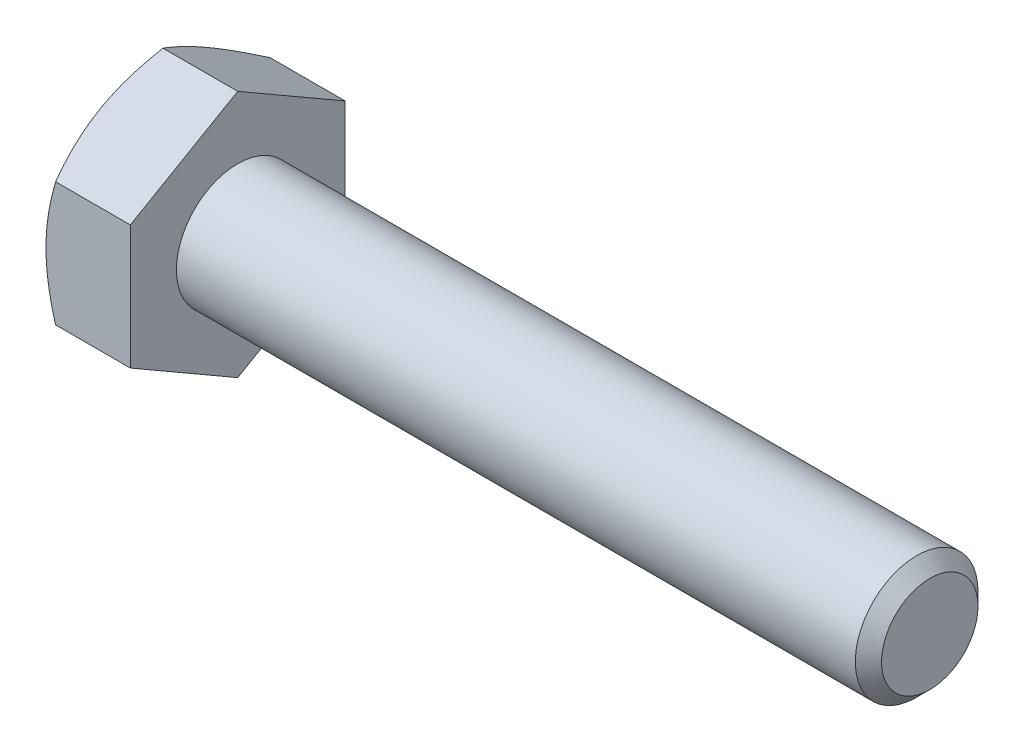
ISO-10303-21;
HEADER;
FILE_DESCRIPTION(('STEP AP214'),'2;1');
FILE_NAME('part.step','',(''),(''),'','','');
FILE_SCHEMA(('AUTOMOTIVE_DESIGN { 1 0 10303 214 1 1 1 1 }'));
ENDSEC;
DATA;
#1=APPLICATION_CONTEXT('core data for automotive mechanical design processes');
#2=APPLICATION_PROTOCOL_DEFINITION('international standard','automotive_design',2000,#1);
#3=PRODUCT_CONTEXT('',#1,'mechanical');
#4=PRODUCT('Part','Part','',(#3));
#5=PRODUCT_RELATED_PRODUCT_CATEGORY('part','',(#4));
#6=PRODUCT_DEFINITION_FORMATION('','',#4);
#7=PRODUCT_DEFINITION_CONTEXT('part definition',#1,'design');
#8=PRODUCT_DEFINITION('design','',#6,#7);
#9=PRODUCT_DEFINITION_SHAPE('','',#8);
#10=(LENGTH_UNIT() NAMED_UNIT(*) SI_UNIT(.MILLI.,.METRE.));
#11=(NAMED_UNIT(*) PLANE_ANGLE_UNIT() SI_UNIT($,.RADIAN.));
#12=(NAMED_UNIT(*) SI_UNIT($,.STERADIAN.) SOLID_ANGLE_UNIT());
#13=UNCERTAINTY_MEASURE_WITH_UNIT(LENGTH_MEASURE(1.E-05),#10,'distance_accuracy_value','');
#14=(GEOMETRIC_REPRESENTATION_CONTEXT(3) GLOBAL_UNCERTAINTY_ASSIGNED_CONTEXT((#13)) GLOBAL_UNIT_ASSIGNED_CONTEXT((#10,
#11,#12)) REPRESENTATION_CONTEXT('',''));
#15=CARTESIAN_POINT('',(0.,0.,0.));
#16=DIRECTION('',(0.,0.,1.));
#17=DIRECTION('',(1.,0.,0.));
#18=AXIS2_PLACEMENT_3D('',#15,#16,#17);
#19=CARTESIAN_POINT('',(-20.0898125,-3.20790243318485,5.55625));
#20=DIRECTION('',(0.,0.,-1.));
#21=DIRECTION('',(-1.,0.,0.));
#22=AXIS2_PLACEMENT_3D('',#19,#20,#21);
#23=PLANE('',#22);
#24=CARTESIAN_POINT('',(-17.3163750598475,-8.74399027782085,5.55625));
#25=CARTESIAN_POINT('',(-17.4351476461868,-8.50018623960062,5.55625));
#26=CARTESIAN_POINT('',(-17.5528174899284,-8.25583594381363,5.55625));
#27=CARTESIAN_POINT('',(-17.785333832282,-7.76575275757413,5.55625));
#28=CARTESIAN_POINT('',(-17.900179909394,-7.52001966736057,5.55625));
#29=CARTESIAN_POINT('',(-18.1269815667827,-7.02567502384834,5.55625));
#30=CARTESIAN_POINT('',(-18.2389190770691,-6.77705515244963,5.55625));
#31=CARTESIAN_POINT('',(-18.4583791452201,-6.27788161036476,5.55625));
#32=CARTESIAN_POINT('',(-18.5659019036307,-6.02732802813559,5.55625));
#33=CARTESIAN_POINT('',(-18.7789068972481,-5.51539046395943,5.55625));
#34=CARTESIAN_POINT('',(-18.8841977010289,-5.25392641019769,5.55625));
#35=CARTESIAN_POINT('',(-19.0871139859531,-4.72798657633179,5.55625));
#36=CARTESIAN_POINT('',(-19.1847386251359,-4.4635104690617,5.55625));
#37=CARTESIAN_POINT('',(-19.3698532159805,-3.93158168881508,5.55625));
#38=CARTESIAN_POINT('',(-19.4573626158621,-3.66413584916098,5.55625));
#39=CARTESIAN_POINT('',(-19.6195224426472,-3.12540698244495,5.55625));
#40=CARTESIAN_POINT('',(-19.6941767862806,-2.8541251515052,5.55625));
#41=CARTESIAN_POINT('',(-19.8267361579561,-2.30908269819076,5.55625));
#42=CARTESIAN_POINT('',(-19.8847346690269,-2.03534517239951,5.55625));
#43=CARTESIAN_POINT('',(-19.9807733321313,-1.48429810038529,5.55625));
#44=CARTESIAN_POINT('',(-20.0188156464521,-1.20698894449172,5.55625));
#45=CARTESIAN_POINT('',(-20.0583928025883,-0.791294730238438,5.55625));
#46=CARTESIAN_POINT('',(-20.0686589019217,-0.653708210797403,5.55625));
#47=CARTESIAN_POINT('',(-20.0833621872177,-0.378228689873298,5.55625));
#48=CARTESIAN_POINT('',(-20.0877999263492,-0.240335718720034,5.55625));
#49=CARTESIAN_POINT('',(-20.0907354775746,0.0355251294735001,5.55625));
#50=CARTESIAN_POINT('',(-20.0892327728321,0.17349301198712,5.55625));
#51=CARTESIAN_POINT('',(-20.080326510162,0.449228444418539,5.55625));
#52=CARTESIAN_POINT('',(-20.0729231815845,0.586996001914224,5.55625));
#53=CARTESIAN_POINT('',(-20.0484869357947,0.914267814879004,5.55625));
#54=CARTESIAN_POINT('',(-20.0288672240741,1.10358330996904,5.55625));
#55=CARTESIAN_POINT('',(-19.979526812407,1.48088314069775,5.55625));
#56=CARTESIAN_POINT('',(-19.949804847865,1.66886730667232,5.55625));
#57=CARTESIAN_POINT('',(-19.8470555520625,2.23056093652213,5.55625));
#58=CARTESIAN_POINT('',(-19.7604606134045,2.60182549681906,5.55625));
#59=CARTESIAN_POINT('',(-19.6093261064939,3.15725728719583,5.55625));
#60=CARTESIAN_POINT('',(-19.5546586125065,3.3442770213325,5.55625));
#61=CARTESIAN_POINT('',(-19.4394060536328,3.71650214758287,5.55625));
#62=CARTESIAN_POINT('',(-19.3788209432783,3.90170752574391,5.55625));
#63=CARTESIAN_POINT('',(-19.252725047258,4.27035971017338,5.55625));
#64=CARTESIAN_POINT('',(-19.1872156566373,4.45380699802654,5.55625));
#65=CARTESIAN_POINT('',(-19.0520659146602,4.81916376337002,5.55625));
#66=CARTESIAN_POINT('',(-18.9824256570347,5.00107327564604,5.55625));
#67=CARTESIAN_POINT('',(-18.7900333966823,5.48965633955828,5.55625));
#68=CARTESIAN_POINT('',(-18.6640472769738,5.79505515575441,5.55625));
#69=CARTESIAN_POINT('',(-18.4046962852557,6.40271511378121,5.55625));
#70=CARTESIAN_POINT('',(-18.2713306013023,6.70497590598521,5.55625));
#71=CARTESIAN_POINT('',(-17.9989631146457,7.30707795189491,5.55625));
#72=CARTESIAN_POINT('',(-17.8599591790448,7.60691823753554,5.55625));
#73=CARTESIAN_POINT('',(-17.577660365316,8.20455029953286,5.55625));
#74=CARTESIAN_POINT('',(-17.4343656605298,8.50234215804727,5.55625));
#75=CARTESIAN_POINT('',(-17.1441870855033,9.09675869917466,5.55625));
#76=CARTESIAN_POINT('',(-16.9972978399505,9.3933807523097,5.55625));
#77=CARTESIAN_POINT('',(-16.700841477218,9.98528417281851,5.55625));
#78=CARTESIAN_POINT('',(-16.5512743379345,10.2805655291008,5.55625));
#79=CARTESIAN_POINT('',(-16.0994394266152,11.1646418956815,5.55625));
#80=CARTESIAN_POINT('',(-15.7939730016145,11.7518013851031,5.55625));
#81=CARTESIAN_POINT('',(-15.2098679596005,12.8613257548756,5.55625));
#82=CARTESIAN_POINT('',(-14.9317985850974,13.3839917708193,5.55625));
#83=CARTESIAN_POINT('',(-14.372301428865,14.42756352459,5.55625));
#84=CARTESIAN_POINT('',(-14.0908734420221,14.9484691523898,5.55625));
#85=CARTESIAN_POINT('',(-13.5264769946515,15.9871872994245,5.55625));
#86=CARTESIAN_POINT('',(-13.2435168360065,16.5050043366708,5.55625));
#87=CARTESIAN_POINT('',(-12.6756898665637,17.5395393792358,5.55625));
#88=CARTESIAN_POINT('',(-12.3908232075218,18.056257467815,5.55625));
#89=CARTESIAN_POINT('',(-12.1052623528106,18.5725892171576,5.55625));
#90=B_SPLINE_CURVE_WITH_KNOTS('',3,(#24,#25,#26,#27,#28,#29,#30,#31,#32,#33,#34,#35,#36,#37,#38,
#39,#40,#41,#42,#43,#44,#45,#46,#47,#48,#49,#50,#51,#52,#53,#54,#55,#56,#57,#58,#59,#60,#61,#62,
#63,#64,#65,#66,#67,#68,#69,#70,#71,#72,#73,#74,#75,#76,#77,#78,#79,#80,#81,#82,#83,#84,#85,#86,
#87,#88,#89),.UNSPECIFIED.,.F.,.F.,(4,2,2,2,2,2,2,2,2,2,2,2,2,2,2,2,2,2,2,2,2,2,2,2,2,2,2,2,2,2,
2,2,4),(0.,0.813597715870463,1.62731614804298,2.44525275654031,3.26315216797367,
4.10866347940256,4.95426752225437,5.79821771301645,6.64191030891903,7.48077063935046,
8.31954005908318,8.73334237828505,9.1471054207352,9.56090446260157,9.97468742138602,
10.5453561295019,11.1160962999972,12.2581342200709,12.8426194652768,13.4271092017353,
14.0114339722529,14.5957454893196,15.5866951889479,16.5777541364282,17.5691915541016,
18.560588972886,19.5535724635683,20.5465641542476,22.5321054768716,24.308190208571,
26.0843839680985,27.8546363109357,29.624749380466),.UNSPECIFIED.);
#91=CARTESIAN_POINT('',(-19.5935482665182,-3.20790243318485,5.55625));
#92=VERTEX_POINT('',#91);
#93=CARTESIAN_POINT('',(-20.0898125,0.,5.55625));
#94=VERTEX_POINT('',#93);
#95=EDGE_CURVE('E284',#92,#94,#90,.T.);
#96=ORIENTED_EDGE('',*,*,#95,.F.);
#97=DIRECTION('',(1.,0.,0.));
#98=VECTOR('',#97,1.);
#99=CARTESIAN_POINT('',(-20.0898125,-3.20790243318485,5.55625));
#100=LINE('',#99,#98);
#101=CARTESIAN_POINT('',(-15.7241875,-3.20790243318485,5.55625));
#102=VERTEX_POINT('',#101);
#103=EDGE_CURVE('E287',#92,#102,#100,.T.);
#104=ORIENTED_EDGE('',*,*,#103,.T.);
#105=DIRECTION('',(0.,1.,0.));
#106=VECTOR('',#105,1.);
#107=CARTESIAN_POINT('',(-15.7241875,-3.20790243318485,5.55625));
#108=LINE('',#107,#106);
#109=CARTESIAN_POINT('',(-15.7241875,3.20790243318486,5.55625));
#110=VERTEX_POINT('',#109);
#111=EDGE_CURVE('E290',#102,#110,#108,.T.);
#112=ORIENTED_EDGE('',*,*,#111,.T.);
#113=DIRECTION('',(1.,0.,0.));
#114=VECTOR('',#113,1.);
#115=CARTESIAN_POINT('',(-20.0898125,3.20790243318486,5.55625));
#116=LINE('',#115,#114);
#117=CARTESIAN_POINT('',(-19.5935482665182,3.20790243318486,5.55625));
#118=VERTEX_POINT('',#117);
#119=EDGE_CURVE('E246',#118,#110,#116,.T.);
#120=ORIENTED_EDGE('',*,*,#119,.F.);
#121=EDGE_CURVE('E123',#94,#118,#90,.T.);
#122=ORIENTED_EDGE('',*,*,#121,.F.);
#123=EDGE_LOOP('',(#96,#104,#112,#120,#122));
#124=FACE_BOUND('',#123,.T.);
#125=ADVANCED_FACE('F46',(#124),#23,.F.);
#126=CARTESIAN_POINT('',(-20.0898125,3.20790243318486,5.55625));
#127=DIRECTION('',(0.,-0.866025403784438,-0.5));
#128=DIRECTION('',(0.,0.5,-0.866025403784439));
#129=AXIS2_PLACEMENT_3D('',#126,#127,#128);
#130=PLANE('',#129);
#131=CARTESIAN_POINT('',(-19.5934815980518,3.20778696313102,5.55645));
#132=CARTESIAN_POINT('',(-19.6341869396287,3.27830048099898,5.43431700443227));
#133=CARTESIAN_POINT('',(-19.6730449606368,3.34907690760433,5.31172863757365));
#134=CARTESIAN_POINT('',(-19.7465575665754,3.49120454378004,5.06555635055765));
#135=CARTESIAN_POINT('',(-19.7812103381981,3.56255598725623,4.94197202526351));
#136=CARTESIAN_POINT('',(-19.8781806144389,3.7777527611819,4.56924027919934));
#137=CARTESIAN_POINT('',(-19.933336445498,3.92244755263586,4.3186215488105));
#138=CARTESIAN_POINT('',(-19.998013595153,4.13898067940738,3.94357517172046));
#139=CARTESIAN_POINT('',(-20.0164383296374,4.21017202280888,3.82026814788998));
#140=CARTESIAN_POINT('',(-20.0473341337596,4.35287639627881,3.57309692257779));
#141=CARTESIAN_POINT('',(-20.059805729438,4.42438939736052,3.44923277130254));
#142=CARTESIAN_POINT('',(-20.0784774134017,4.56753961185542,3.20128932668299));
#143=CARTESIAN_POINT('',(-20.0846846193166,4.63917659144933,3.07721043832556));
#144=CARTESIAN_POINT('',(-20.0907010825862,4.7825127822332,2.82894487332451));
#145=CARTESIAN_POINT('',(-20.0905105375727,4.85421199143242,2.70475820012895));
#146=CARTESIAN_POINT('',(-20.0811942573071,5.05064720059278,2.36452243746779));
#147=CARTESIAN_POINT('',(-20.0655528403106,5.1753189069971,2.14858470770919));
#148=CARTESIAN_POINT('',(-20.0159525950254,5.42383425573453,1.71814349723526));
#149=CARTESIAN_POINT('',(-19.9819768117333,5.54767702400135,1.50364153044716));
#150=CARTESIAN_POINT('',(-19.8970467499519,5.79669255822861,1.07233397329164));
#151=CARTESIAN_POINT('',(-19.8457326119579,5.92183390122649,0.8555828090919));
#152=CARTESIAN_POINT('',(-19.7292700447076,6.17025031750736,0.42531295465925));
#153=CARTESIAN_POINT('',(-19.6641489741206,6.29352857247572,0.211788753585623));
#154=CARTESIAN_POINT('',(-19.5934815980518,6.41592033642355,-0.000199999999997832));
#155=B_SPLINE_CURVE_WITH_KNOTS('',3,(#131,#132,#133,#134,#135,#136,#137,#138,#139,#140,#141,
#142,#143,#144,#145,#146,#147,#148,#149,#150,#151,#152,#153,#154),.UNSPECIFIED.,.F.,.F.,(4,2,2,
2,2,2,2,2,2,2,2,4),(0.,0.440316908268042,0.880823012040824,1.76366572331169,2.19427472390783,
2.62484566732156,3.05492684132792,3.4849947297767,4.23370964386675,4.98311813377593,
5.74914806559356,6.51367405016873),.UNSPECIFIED.);
#156=CARTESIAN_POINT('',(-20.0898125,4.81185364977729,2.778125));
#157=VERTEX_POINT('',#156);
#158=EDGE_CURVE('E119',#118,#157,#155,.T.);
#159=ORIENTED_EDGE('',*,*,#158,.F.);
#160=ORIENTED_EDGE('',*,*,#119,.T.);
#161=DIRECTION('',(0.,0.5,-0.866025403784438));
#162=VECTOR('',#161,1.);
#163=CARTESIAN_POINT('',(-15.7241875,3.20790243318486,5.55625));
#164=LINE('',#163,#162);
#165=CARTESIAN_POINT('',(-15.7241875,6.41580486636972,0.));
#166=VERTEX_POINT('',#165);
#167=EDGE_CURVE('E314',#110,#166,#164,.T.);
#168=ORIENTED_EDGE('',*,*,#167,.T.);
#169=DIRECTION('',(1.,0.,0.));
#170=VECTOR('',#169,1.);
#171=CARTESIAN_POINT('',(-20.0898125,6.41580486636972,0.));
#172=LINE('',#171,#170);
#173=CARTESIAN_POINT('',(-19.5935482665182,6.41580486636972,0.));
#174=VERTEX_POINT('',#173);
#175=EDGE_CURVE('E144',#174,#166,#172,.T.);
#176=ORIENTED_EDGE('',*,*,#175,.F.);
#177=EDGE_CURVE('E128',#157,#174,#155,.T.);
#178=ORIENTED_EDGE('',*,*,#177,.F.);
#179=EDGE_LOOP('',(#159,#160,#168,#176,#178));
#180=FACE_BOUND('',#179,.T.);
#181=ADVANCED_FACE('F142',(#180),#130,.F.);
#182=CARTESIAN_POINT('',(-20.0898125,6.41580486636972,0.));
#183=DIRECTION('',(0.,-0.866025403784439,0.5));
#184=DIRECTION('',(0.,-0.5,-0.866025403784439));
#185=AXIS2_PLACEMENT_3D('',#182,#183,#184);
#186=PLANE('',#185);
#187=CARTESIAN_POINT('',(-19.5934815980518,6.41592033642355,0.000200000000001893));
#188=CARTESIAN_POINT('',(-19.6341869396287,6.34540681855559,-0.121932995567729));
#189=CARTESIAN_POINT('',(-19.6730449606368,6.27463039195025,-0.244521362426351));
#190=CARTESIAN_POINT('',(-19.7465575665754,6.13250275577453,-0.490693649442355));
#191=CARTESIAN_POINT('',(-19.7812103381981,6.06115131229835,-0.614277974736486));
#192=CARTESIAN_POINT('',(-19.8781806144389,5.84595453837268,-0.987009720800661));
#193=CARTESIAN_POINT('',(-19.933336445498,5.70125974691872,-1.2376284511895));
#194=CARTESIAN_POINT('',(-19.998013595153,5.48472662014719,-1.61267482827954));
#195=CARTESIAN_POINT('',(-20.0164383296374,5.41353527674569,-1.73598185211002));
#196=CARTESIAN_POINT('',(-20.0473341337596,5.27083090327577,-1.98315307742221));
#197=CARTESIAN_POINT('',(-20.059805729438,5.19931790219406,-2.10701722869746));
#198=CARTESIAN_POINT('',(-20.0784774134017,5.05616768769916,-2.35496067331701));
#199=CARTESIAN_POINT('',(-20.0846846193166,4.98453070810525,-2.47903956167444));
#200=CARTESIAN_POINT('',(-20.0907010825862,4.84119451732138,-2.72730512667549));
#201=CARTESIAN_POINT('',(-20.0905105375727,4.76949530812216,-2.85149179987105));
#202=CARTESIAN_POINT('',(-20.0811942573071,4.5730600989618,-3.19172756253221));
#203=CARTESIAN_POINT('',(-20.0655528403106,4.44838839255747,-3.40766529229081));
#204=CARTESIAN_POINT('',(-20.0159525950254,4.19987304382004,-3.83810650276474));
#205=CARTESIAN_POINT('',(-19.9819768117333,4.07603027555323,-4.05260846955284));
#206=CARTESIAN_POINT('',(-19.8970467499519,3.82701474132597,-4.48391602670836));
#207=CARTESIAN_POINT('',(-19.8457326119579,3.70187339832809,-4.7006671909081));
#208=CARTESIAN_POINT('',(-19.7292700447076,3.45345698204721,-5.13093704534075));
#209=CARTESIAN_POINT('',(-19.6641489741206,3.33017872707885,-5.34446124641438));
#210=CARTESIAN_POINT('',(-19.5934815980518,3.20778696313102,-5.55645));
#211=B_SPLINE_CURVE_WITH_KNOTS('',3,(#187,#188,#189,#190,#191,#192,#193,#194,#195,#196,#197,
#198,#199,#200,#201,#202,#203,#204,#205,#206,#207,#208,#209,#210),.UNSPECIFIED.,.F.,.F.,(4,2,2,
2,2,2,2,2,2,2,2,4),(0.,0.440316908268041,0.880823012040823,1.76366572331169,2.19427472390783,
2.62484566732156,3.05492684132792,3.48499472977669,4.23370964386674,4.98311813377593,
5.74914806559356,6.51367405016872),.UNSPECIFIED.);
#212=CARTESIAN_POINT('',(-20.0898125,4.81185364977729,-2.778125));
#213=VERTEX_POINT('',#212);
#214=EDGE_CURVE('E133',#174,#213,#211,.T.);
#215=ORIENTED_EDGE('',*,*,#214,.F.);
#216=ORIENTED_EDGE('',*,*,#175,.T.);
#217=DIRECTION('',(0.,-0.5,-0.866025403784439));
#218=VECTOR('',#217,1.);
#219=CARTESIAN_POINT('',(-15.7241875,6.41580486636972,0.));
#220=LINE('',#219,#218);
#221=CARTESIAN_POINT('',(-15.7241875,3.20790243318486,-5.55625));
#222=VERTEX_POINT('',#221);
#223=EDGE_CURVE('E311',#166,#222,#220,.T.);
#224=ORIENTED_EDGE('',*,*,#223,.T.);
#225=DIRECTION('',(1.,0.,0.));
#226=VECTOR('',#225,1.);
#227=CARTESIAN_POINT('',(-20.0898125,3.20790243318486,-5.55625));
#228=LINE('',#227,#226);
#229=CARTESIAN_POINT('',(-19.5935482665182,3.20790243318486,-5.55625));
#230=VERTEX_POINT('',#229);
#231=EDGE_CURVE('E306',#230,#222,#228,.T.);
#232=ORIENTED_EDGE('',*,*,#231,.F.);
#233=EDGE_CURVE('E147',#213,#230,#211,.T.);
#234=ORIENTED_EDGE('',*,*,#233,.F.);
#235=EDGE_LOOP('',(#215,#216,#224,#232,#234));
#236=FACE_BOUND('',#235,.T.);
#237=ADVANCED_FACE('F208',(#236),#186,.F.);
#238=CARTESIAN_POINT('',(-20.0898125,3.20790243318486,-5.55625));
#239=DIRECTION('',(0.,0.,1.));
#240=DIRECTION('',(1.,0.,0.));
#241=AXIS2_PLACEMENT_3D('',#238,#239,#240);
#242=PLANE('',#241);
#243=CARTESIAN_POINT('',(-17.3163750598475,-8.74399027782085,-5.55625));
#244=CARTESIAN_POINT('',(-17.4351476461868,-8.50018623960062,-5.55625));
#245=CARTESIAN_POINT('',(-17.5528174899284,-8.25583594381362,-5.55625));
#246=CARTESIAN_POINT('',(-17.785333832282,-7.76575275757412,-5.55625));
#247=CARTESIAN_POINT('',(-17.900179909394,-7.52001966736057,-5.55625));
#248=CARTESIAN_POINT('',(-18.1269815667827,-7.02567502384834,-5.55625));
#249=CARTESIAN_POINT('',(-18.2389190770691,-6.77705515244963,-5.55625));
#250=CARTESIAN_POINT('',(-18.4583791452201,-6.27788161036475,-5.55625));
#251=CARTESIAN_POINT('',(-18.5659019036307,-6.02732802813559,-5.55625));
#252=CARTESIAN_POINT('',(-18.7789068972481,-5.51539046395943,-5.55625));
#253=CARTESIAN_POINT('',(-18.884197701029,-5.25392641019769,-5.55625));
#254=CARTESIAN_POINT('',(-19.0871139859531,-4.72798657633179,-5.55625));
#255=CARTESIAN_POINT('',(-19.1847386251359,-4.46351046906169,-5.55625));
#256=CARTESIAN_POINT('',(-19.3698532159805,-3.93158168881508,-5.55625));
#257=CARTESIAN_POINT('',(-19.4573626158621,-3.66413584916098,-5.55625));
#258=CARTESIAN_POINT('',(-19.6195224426472,-3.12540698244495,-5.55625));
#259=CARTESIAN_POINT('',(-19.6941767862806,-2.8541251515052,-5.55625));
#260=CARTESIAN_POINT('',(-19.8267361579561,-2.30908269819076,-5.55625));
#261=CARTESIAN_POINT('',(-19.8847346690269,-2.03534517239951,-5.55625));
#262=CARTESIAN_POINT('',(-19.9807733321313,-1.4842981003853,-5.55625));
#263=CARTESIAN_POINT('',(-20.0188156464521,-1.20698894449172,-5.55625));
#264=CARTESIAN_POINT('',(-20.0583928025883,-0.791294730238441,-5.55625));
#265=CARTESIAN_POINT('',(-20.0686589019217,-0.653708210797406,-5.55625));
#266=CARTESIAN_POINT('',(-20.0833621872178,-0.378228689873302,-5.55625));
#267=CARTESIAN_POINT('',(-20.0877999263492,-0.240335718720038,-5.55625));
#268=CARTESIAN_POINT('',(-20.0907354775746,0.035525129473495,-5.55625));
#269=CARTESIAN_POINT('',(-20.0892327728321,0.173493011987115,-5.55625));
#270=CARTESIAN_POINT('',(-20.080326510162,0.449228444418533,-5.55625));
#271=CARTESIAN_POINT('',(-20.0729231815845,0.586996001914218,-5.55625));
#272=CARTESIAN_POINT('',(-20.0484869357947,0.914267814878999,-5.55625));
#273=CARTESIAN_POINT('',(-20.0288672240741,1.10358330996903,-5.55625));
#274=CARTESIAN_POINT('',(-19.979526812407,1.48088314069774,-5.55625));
#275=CARTESIAN_POINT('',(-19.9498048478651,1.66886730667231,-5.55625));
#276=CARTESIAN_POINT('',(-19.8470555520625,2.23056093652212,-5.55625));
#277=CARTESIAN_POINT('',(-19.7604606134045,2.60182549681905,-5.55625));
#278=CARTESIAN_POINT('',(-19.6093261064939,3.15725728719582,-5.55625));
#279=CARTESIAN_POINT('',(-19.5546586125065,3.34427702133249,-5.55625));
#280=CARTESIAN_POINT('',(-19.4394060536328,3.71650214758286,-5.55625));
#281=CARTESIAN_POINT('',(-19.3788209432783,3.9017075257439,-5.55625));
#282=CARTESIAN_POINT('',(-19.2527250472581,4.27035971017337,-5.55625));
#283=CARTESIAN_POINT('',(-19.1872156566373,4.45380699802653,-5.55625));
#284=CARTESIAN_POINT('',(-19.0520659146603,4.81916376337001,-5.55625));
#285=CARTESIAN_POINT('',(-18.9824256570347,5.00107327564603,-5.55625));
#286=CARTESIAN_POINT('',(-18.7900333966823,5.48965633955827,-5.55625));
#287=CARTESIAN_POINT('',(-18.6640472769738,5.7950551557544,-5.55625));
#288=CARTESIAN_POINT('',(-18.4046962852557,6.40271511378119,-5.55625));
#289=CARTESIAN_POINT('',(-18.2713306013023,6.7049759059852,-5.55625));
#290=CARTESIAN_POINT('',(-17.9989631146457,7.3070779518949,-5.55625));
#291=CARTESIAN_POINT('',(-17.8599591790448,7.60691823753553,-5.55625));
#292=CARTESIAN_POINT('',(-17.5776603653161,8.20455029953285,-5.55625));
#293=CARTESIAN_POINT('',(-17.4343656605298,8.50234215804726,-5.55625));
#294=CARTESIAN_POINT('',(-17.1441870855033,9.09675869917466,-5.55625));
#295=CARTESIAN_POINT('',(-16.9972978399505,9.3933807523097,-5.55625));
#296=CARTESIAN_POINT('',(-16.700841477218,9.9852841728185,-5.55625));
#297=CARTESIAN_POINT('',(-16.5512743379345,10.2805655291007,-5.55625));
#298=CARTESIAN_POINT('',(-16.0994394266152,11.1646418956815,-5.55625));
#299=CARTESIAN_POINT('',(-15.7939730016145,11.7518013851031,-5.55625));
#300=CARTESIAN_POINT('',(-15.2098679596005,12.8613257548756,-5.55625));
#301=CARTESIAN_POINT('',(-14.9317985850975,13.3839917708193,-5.55625));
#302=CARTESIAN_POINT('',(-14.372301428865,14.42756352459,-5.55625));
#303=CARTESIAN_POINT('',(-14.0908734420222,14.9484691523898,-5.55625));
#304=CARTESIAN_POINT('',(-13.5264769946515,15.9871872994245,-5.55625));
#305=CARTESIAN_POINT('',(-13.2435168360065,16.5050043366708,-5.55625));
#306=CARTESIAN_POINT('',(-12.6756898665637,17.5395393792358,-5.55625));
#307=CARTESIAN_POINT('',(-12.3908232075218,18.056257467815,-5.55625));
#308=CARTESIAN_POINT('',(-12.1052623528106,18.5725892171576,-5.55625));
#309=B_SPLINE_CURVE_WITH_KNOTS('',3,(#243,#244,#245,#246,#247,#248,#249,#250,#251,#252,#253,
#254,#255,#256,#257,#258,#259,#260,#261,#262,#263,#264,#265,#266,#267,#268,#269,#270,#271,#272,
#273,#274,#275,#276,#277,#278,#279,#280,#281,#282,#283,#284,#285,#286,#287,#288,#289,#290,#291,
#292,#293,#294,#295,#296,#297,#298,#299,#300,#301,#302,#303,#304,#305,#306,#307,#308),
.UNSPECIFIED.,.F.,.F.,(4,2,2,2,2,2,2,2,2,2,2,2,2,2,2,2,2,2,2,2,2,2,2,2,2,2,2,2,2,2,2,2,4),(0.,
0.813597715870461,1.62731614804298,2.4452527565403,3.26315216797367,4.10866347940255,
4.95426752225437,5.79821771301645,6.64191030891902,7.48077063935046,8.31954005908317,
8.73334237828505,9.14710542073519,9.56090446260156,9.97468742138601,10.5453561295019,
11.1160962999972,12.2581342200709,12.8426194652768,13.4271092017353,14.0114339722529,
14.5957454893196,15.5866951889479,16.5777541364282,17.5691915541016,18.5605889728859,
19.5535724635683,20.5465641542476,22.5321054768716,24.308190208571,26.0843839680985,
27.8546363109357,29.624749380466),.UNSPECIFIED.);
#310=CARTESIAN_POINT('',(-20.0898125,0.,-5.55625));
#311=VERTEX_POINT('',#310);
#312=EDGE_CURVE('E202',#230,#311,#309,.F.);
#313=ORIENTED_EDGE('',*,*,#312,.F.);
#314=ORIENTED_EDGE('',*,*,#231,.T.);
#315=DIRECTION('',(0.,-1.,0.));
#316=VECTOR('',#315,1.);
#317=CARTESIAN_POINT('',(-15.7241875,3.20790243318486,-5.55625));
#318=LINE('',#317,#316);
#319=CARTESIAN_POINT('',(-15.7241875,-3.20790243318486,-5.55625));
#320=VERTEX_POINT('',#319);
#321=EDGE_CURVE('E319',#222,#320,#318,.T.);
#322=ORIENTED_EDGE('',*,*,#321,.T.);
#323=DIRECTION('',(1.,0.,0.));
#324=VECTOR('',#323,1.);
#325=CARTESIAN_POINT('',(-20.0898125,-3.20790243318486,-5.55625));
#326=LINE('',#325,#324);
#327=CARTESIAN_POINT('',(-19.5935482665182,-3.20790243318486,-5.55625));
#328=VERTEX_POINT('',#327);
#329=EDGE_CURVE('E268',#328,#320,#326,.T.);
#330=ORIENTED_EDGE('',*,*,#329,.F.);
#331=EDGE_CURVE('E195',#311,#328,#309,.F.);
#332=ORIENTED_EDGE('',*,*,#331,.F.);
#333=EDGE_LOOP('',(#313,#314,#322,#330,#332));
#334=FACE_BOUND('',#333,.T.);
#335=ADVANCED_FACE('F204',(#334),#242,.F.);
#336=CARTESIAN_POINT('',(-20.0898125,-3.20790243318486,-5.55625));
#337=DIRECTION('',(0.,0.866025403784439,0.5));
#338=DIRECTION('',(0.,-0.5,0.866025403784439));
#339=AXIS2_PLACEMENT_3D('',#336,#337,#338);
#340=PLANE('',#339);
#341=CARTESIAN_POINT('',(-19.5934815980518,-3.20778696313102,-5.55645));
#342=CARTESIAN_POINT('',(-19.6341869396287,-3.27830048099898,-5.43431700443227));
#343=CARTESIAN_POINT('',(-19.6730449606368,-3.34907690760433,-5.31172863757364));
#344=CARTESIAN_POINT('',(-19.7465575665754,-3.49120454378004,-5.06555635055764));
#345=CARTESIAN_POINT('',(-19.7812103381981,-3.56255598725623,-4.94197202526351));
#346=CARTESIAN_POINT('',(-19.8781806144389,-3.7777527611819,-4.56924027919934));
#347=CARTESIAN_POINT('',(-19.933336445498,-3.92244755263586,-4.3186215488105));
#348=CARTESIAN_POINT('',(-19.998013595153,-4.13898067940738,-3.94357517172046));
#349=CARTESIAN_POINT('',(-20.0164383296374,-4.21017202280888,-3.82026814788997));
#350=CARTESIAN_POINT('',(-20.0473341337596,-4.35287639627881,-3.57309692257778));
#351=CARTESIAN_POINT('',(-20.059805729438,-4.42438939736052,-3.44923277130254));
#352=CARTESIAN_POINT('',(-20.0784774134017,-4.56753961185542,-3.20128932668298));
#353=CARTESIAN_POINT('',(-20.0846846193166,-4.63917659144933,-3.07721043832556));
#354=CARTESIAN_POINT('',(-20.0907010825862,-4.7825127822332,-2.82894487332451));
#355=CARTESIAN_POINT('',(-20.0905105375727,-4.85421199143242,-2.70475820012895));
#356=CARTESIAN_POINT('',(-20.0811942573071,-5.05064720059277,-2.36452243746779));
#357=CARTESIAN_POINT('',(-20.0655528403106,-5.1753189069971,-2.14858470770919));
#358=CARTESIAN_POINT('',(-20.0159525950254,-5.42383425573453,-1.71814349723526));
#359=CARTESIAN_POINT('',(-19.9819768117333,-5.54767702400135,-1.50364153044716));
#360=CARTESIAN_POINT('',(-19.8970467499519,-5.7966925582286,-1.07233397329164));
#361=CARTESIAN_POINT('',(-19.8457326119579,-5.92183390122649,-0.855582809091897));
#362=CARTESIAN_POINT('',(-19.7292700447076,-6.17025031750736,-0.425312954659246));
#363=CARTESIAN_POINT('',(-19.6641489741206,-6.29352857247572,-0.21178875358562));
#364=CARTESIAN_POINT('',(-19.5934815980518,-6.41592033642355,0.000199999999999564));
#365=B_SPLINE_CURVE_WITH_KNOTS('',3,(#341,#342,#343,#344,#345,#346,#347,#348,#349,#350,#351,
#352,#353,#354,#355,#356,#357,#358,#359,#360,#361,#362,#363,#364),.UNSPECIFIED.,.F.,.F.,(4,2,2,
2,2,2,2,2,2,2,2,4),(0.,0.440316908268042,0.880823012040822,1.76366572331169,2.19427472390783,
2.62484566732156,3.05492684132792,3.48499472977669,4.23370964386674,4.98311813377593,
5.74914806559356,6.51367405016872),.UNSPECIFIED.);
#366=CARTESIAN_POINT('',(-20.0898125,-4.81185364977729,-2.778125));
#367=VERTEX_POINT('',#366);
#368=EDGE_CURVE('E203',#328,#367,#365,.T.);
#369=ORIENTED_EDGE('',*,*,#368,.F.);
#370=ORIENTED_EDGE('',*,*,#329,.T.);
#371=DIRECTION('',(0.,-0.5,0.866025403784439));
#372=VECTOR('',#371,1.);
#373=CARTESIAN_POINT('',(-15.7241875,-3.20790243318486,-5.55625));
#374=LINE('',#373,#372);
#375=CARTESIAN_POINT('',(-15.7241875,-6.41580486636971,0.));
#376=VERTEX_POINT('',#375);
#377=EDGE_CURVE('E300',#320,#376,#374,.T.);
#378=ORIENTED_EDGE('',*,*,#377,.T.);
#379=DIRECTION('',(1.,0.,0.));
#380=VECTOR('',#379,1.);
#381=CARTESIAN_POINT('',(-20.0898125,-6.41580486636971,0.));
#382=LINE('',#381,#380);
#383=CARTESIAN_POINT('',(-19.5935482665182,-6.41580486636971,0.));
#384=VERTEX_POINT('',#383);
#385=EDGE_CURVE('E295',#384,#376,#382,.T.);
#386=ORIENTED_EDGE('',*,*,#385,.F.);
#387=EDGE_CURVE('E189',#367,#384,#365,.T.);
#388=ORIENTED_EDGE('',*,*,#387,.F.);
#389=EDGE_LOOP('',(#369,#370,#378,#386,#388));
#390=FACE_BOUND('',#389,.T.);
#391=ADVANCED_FACE('F207',(#390),#340,.F.);
#392=CARTESIAN_POINT('',(-20.0898125,-6.41580486636971,0.));
#393=DIRECTION('',(0.,0.866025403784439,-0.5));
#394=DIRECTION('',(0.,0.5,0.866025403784439));
#395=AXIS2_PLACEMENT_3D('',#392,#393,#394);
#396=PLANE('',#395);
#397=CARTESIAN_POINT('',(-19.5934815980518,-6.41592033642355,-0.000200000000000231));
#398=CARTESIAN_POINT('',(-19.6341869396287,-6.34540681855559,0.121932995567731));
#399=CARTESIAN_POINT('',(-19.6730449606368,-6.27463039195024,0.244521362426353));
#400=CARTESIAN_POINT('',(-19.7465575665754,-6.13250275577453,0.490693649442356));
#401=CARTESIAN_POINT('',(-19.7812103381981,-6.06115131229834,0.614277974736487));
#402=CARTESIAN_POINT('',(-19.8781806144389,-5.84595453837267,0.987009720800662));
#403=CARTESIAN_POINT('',(-19.933336445498,-5.70125974691872,1.2376284511895));
#404=CARTESIAN_POINT('',(-19.998013595153,-5.48472662014719,1.61267482827954));
#405=CARTESIAN_POINT('',(-20.0164383296374,-5.41353527674569,1.73598185211002));
#406=CARTESIAN_POINT('',(-20.0473341337596,-5.27083090327576,1.98315307742221));
#407=CARTESIAN_POINT('',(-20.059805729438,-5.19931790219406,2.10701722869746));
#408=CARTESIAN_POINT('',(-20.0784774134017,-5.05616768769915,2.35496067331701));
#409=CARTESIAN_POINT('',(-20.0846846193166,-4.98453070810525,2.47903956167444));
#410=CARTESIAN_POINT('',(-20.0907010825862,-4.84119451732137,2.72730512667549));
#411=CARTESIAN_POINT('',(-20.0905105375727,-4.76949530812215,2.85149179987105));
#412=CARTESIAN_POINT('',(-20.0811942573071,-4.5730600989618,3.1917275625322));
#413=CARTESIAN_POINT('',(-20.0655528403106,-4.44838839255747,3.40766529229081));
#414=CARTESIAN_POINT('',(-20.0159525950254,-4.19987304382004,3.83810650276474));
#415=CARTESIAN_POINT('',(-19.9819768117333,-4.07603027555323,4.05260846955284));
#416=CARTESIAN_POINT('',(-19.8970467499519,-3.82701474132597,4.48391602670836));
#417=CARTESIAN_POINT('',(-19.8457326119579,-3.70187339832808,4.7006671909081));
#418=CARTESIAN_POINT('',(-19.7292700447076,-3.45345698204721,5.13093704534075));
#419=CARTESIAN_POINT('',(-19.6641489741206,-3.33017872707885,5.34446124641438));
#420=CARTESIAN_POINT('',(-19.5934815980518,-3.20778696313102,5.55645));
#421=B_SPLINE_CURVE_WITH_KNOTS('',3,(#397,#398,#399,#400,#401,#402,#403,#404,#405,#406,#407,
#408,#409,#410,#411,#412,#413,#414,#415,#416,#417,#418,#419,#420),.UNSPECIFIED.,.F.,.F.,(4,2,2,
2,2,2,2,2,2,2,2,4),(0.,0.440316908268042,0.880823012040824,1.76366572331169,2.19427472390783,
2.62484566732156,3.05492684132792,3.48499472977669,4.23370964386674,4.98311813377593,
5.74914806559356,6.51367405016873),.UNSPECIFIED.);
#422=CARTESIAN_POINT('',(-20.0898125,-4.81185364977729,2.778125));
#423=VERTEX_POINT('',#422);
#424=EDGE_CURVE('E277',#384,#423,#421,.T.);
#425=ORIENTED_EDGE('',*,*,#424,.F.);
#426=ORIENTED_EDGE('',*,*,#385,.T.);
#427=DIRECTION('',(0.,0.5,0.866025403784439));
#428=VECTOR('',#427,1.);
#429=CARTESIAN_POINT('',(-15.7241875,-6.41580486636971,0.));
#430=LINE('',#429,#428);
#431=EDGE_CURVE('E292',#376,#102,#430,.T.);
#432=ORIENTED_EDGE('',*,*,#431,.T.);
#433=ORIENTED_EDGE('',*,*,#103,.F.);
#434=EDGE_CURVE('E139',#423,#92,#421,.T.);
#435=ORIENTED_EDGE('',*,*,#434,.F.);
#436=EDGE_LOOP('',(#425,#426,#432,#433,#435));
#437=FACE_BOUND('',#436,.T.);
#438=ADVANCED_FACE('F230',(#437),#396,.F.);
#439=CARTESIAN_POINT('',(-15.7241875,0.,0.));
#440=DIRECTION('',(1.,0.,0.));
#441=DIRECTION('',(0.,0.,-1.));
#442=AXIS2_PLACEMENT_3D('',#439,#440,#441);
#443=CYLINDRICAL_SURFACE('',#442,3.175);
#444=CARTESIAN_POINT('',(19.4094553571483,0.,0.));
#445=DIRECTION('',(1.,0.,0.));
#446=DIRECTION('',(0.,0.,-1.));
#447=AXIS2_PLACEMENT_3D('',#444,#445,#446);
#448=CIRCLE('',#447,3.175);
#449=CARTESIAN_POINT('',(19.4094553571483,0.,-3.175));
#450=VERTEX_POINT('',#449);
#451=EDGE_CURVE('E239',#450,#450,#448,.F.);
#452=ORIENTED_EDGE('',*,*,#451,.T.);
#453=EDGE_LOOP('',(#452));
#454=FACE_BOUND('',#453,.T.);
#455=CARTESIAN_POINT('',(-15.7241875,0.,0.));
#456=DIRECTION('',(-1.,0.,0.));
#457=DIRECTION('',(0.,0.,1.));
#458=AXIS2_PLACEMENT_3D('',#455,#456,#457);
#459=CIRCLE('',#458,3.175);
#460=CARTESIAN_POINT('',(-15.7241875,0.,3.175));
#461=VERTEX_POINT('',#460);
#462=EDGE_CURVE('E242',#461,#461,#459,.F.);
#463=ORIENTED_EDGE('',*,*,#462,.T.);
#464=EDGE_LOOP('',(#463));
#465=FACE_BOUND('',#464,.T.);
#466=ADVANCED_FACE('F227',(#454,#465),#443,.T.);
#467=CARTESIAN_POINT('',(20.0898125,0.,0.));
#468=DIRECTION('',(1.,0.,0.));
#469=DIRECTION('',(0.,0.,-1.));
#470=AXIS2_PLACEMENT_3D('',#467,#468,#469);
#471=PLANE('',#470);
#472=CARTESIAN_POINT('',(20.0898125,0.,0.));
#473=DIRECTION('',(1.,0.,0.));
#474=DIRECTION('',(0.,0.,-1.));
#475=AXIS2_PLACEMENT_3D('',#472,#473,#474);
#476=CIRCLE('',#475,2.4946428571483);
#477=CARTESIAN_POINT('',(20.0898125,0.,-2.4946428571483));
#478=VERTEX_POINT('',#477);
#479=EDGE_CURVE('E245',#478,#478,#476,.T.);
#480=ORIENTED_EDGE('',*,*,#479,.T.);
#481=EDGE_LOOP('',(#480));
#482=FACE_BOUND('',#481,.T.);
#483=ADVANCED_FACE('F225',(#482),#471,.T.);
#484=CARTESIAN_POINT('',(20.0898125,0.,0.));
#485=DIRECTION('',(-1.,0.,0.));
#486=DIRECTION('',(0.,0.,1.));
#487=AXIS2_PLACEMENT_3D('',#484,#485,#486);
#488=CONICAL_SURFACE('',#487,2.4946428571483,0.785398163397448);
#489=ORIENTED_EDGE('',*,*,#451,.F.);
#490=EDGE_LOOP('',(#489));
#491=FACE_BOUND('',#490,.T.);
#492=ORIENTED_EDGE('',*,*,#479,.F.);
#493=EDGE_LOOP('',(#492));
#494=FACE_BOUND('',#493,.T.);
#495=ADVANCED_FACE('F48',(#491,#494),#488,.T.);
#496=CARTESIAN_POINT('',(-15.7241875,3.20790243318486,5.55625));
#497=DIRECTION('',(-1.,0.,0.));
#498=DIRECTION('',(0.,0.,1.));
#499=AXIS2_PLACEMENT_3D('',#496,#497,#498);
#500=PLANE('',#499);
#501=ORIENTED_EDGE('',*,*,#462,.F.);
#502=EDGE_LOOP('',(#501));
#503=FACE_BOUND('',#502,.T.);
#504=ORIENTED_EDGE('',*,*,#111,.F.);
#505=ORIENTED_EDGE('',*,*,#431,.F.);
#506=ORIENTED_EDGE('',*,*,#377,.F.);
#507=ORIENTED_EDGE('',*,*,#321,.F.);
#508=ORIENTED_EDGE('',*,*,#223,.F.);
#509=ORIENTED_EDGE('',*,*,#167,.F.);
#510=EDGE_LOOP('',(#504,#505,#506,#507,#508,#509));
#511=FACE_BOUND('',#510,.T.);
#512=ADVANCED_FACE('F174',(#503,#511),#500,.F.);
#513=CARTESIAN_POINT('',(-20.0898125,0.,0.));
#514=DIRECTION('',(1.,0.,0.));
#515=DIRECTION('',(0.,0.,1.));
#516=AXIS2_PLACEMENT_3D('',#513,#514,#515);
#517=CONICAL_SURFACE('',#516,5.55625,1.0471975511966);
#518=ORIENTED_EDGE('',*,*,#95,.T.);
#519=CARTESIAN_POINT('',(-20.0898125,0.,0.));
#520=DIRECTION('',(-1.,0.,0.));
#521=DIRECTION('',(0.,0.,1.));
#522=AXIS2_PLACEMENT_3D('',#519,#520,#521);
#523=CIRCLE('',#522,5.55625);
#524=EDGE_CURVE('E50',#423,#94,#523,.T.);
#525=ORIENTED_EDGE('',*,*,#524,.F.);
#526=ORIENTED_EDGE('',*,*,#434,.T.);
#527=EDGE_LOOP('',(#518,#525,#526));
#528=FACE_BOUND('',#527,.T.);
#529=ADVANCED_FACE('F169',(#528),#517,.T.);
#530=ORIENTED_EDGE('',*,*,#387,.T.);
#531=ORIENTED_EDGE('',*,*,#424,.T.);
#532=EDGE_CURVE('E71',#367,#423,#523,.T.);
#533=ORIENTED_EDGE('',*,*,#532,.F.);
#534=EDGE_LOOP('',(#530,#531,#533));
#535=FACE_BOUND('',#534,.T.);
#536=ADVANCED_FACE('F173',(#535),#517,.T.);
#537=ORIENTED_EDGE('',*,*,#331,.T.);
#538=ORIENTED_EDGE('',*,*,#368,.T.);
#539=EDGE_CURVE('E257',#311,#367,#523,.T.);
#540=ORIENTED_EDGE('',*,*,#539,.F.);
#541=EDGE_LOOP('',(#537,#538,#540));
#542=FACE_BOUND('',#541,.T.);
#543=ADVANCED_FACE('F271',(#542),#517,.T.);
#544=ORIENTED_EDGE('',*,*,#233,.T.);
#545=ORIENTED_EDGE('',*,*,#312,.T.);
#546=EDGE_CURVE('E56',#213,#311,#523,.T.);
#547=ORIENTED_EDGE('',*,*,#546,.F.);
#548=EDGE_LOOP('',(#544,#545,#547));
#549=FACE_BOUND('',#548,.T.);
#550=ADVANCED_FACE('F329',(#549),#517,.T.);
#551=ORIENTED_EDGE('',*,*,#177,.T.);
#552=ORIENTED_EDGE('',*,*,#214,.T.);
#553=EDGE_CURVE('E12',#157,#213,#523,.T.);
#554=ORIENTED_EDGE('',*,*,#553,.F.);
#555=EDGE_LOOP('',(#551,#552,#554));
#556=FACE_BOUND('',#555,.T.);
#557=ADVANCED_FACE('F131',(#556),#517,.T.);
#558=ORIENTED_EDGE('',*,*,#121,.T.);
#559=ORIENTED_EDGE('',*,*,#158,.T.);
#560=CARTESIAN_POINT('',(-20.0898125,0.,0.));
#561=DIRECTION('',(-1.,0.,0.));
#562=DIRECTION('',(0.,0.,1.));
#563=AXIS2_PLACEMENT_3D('',#560,#561,#562);
#564=CIRCLE('',#563,5.55625);
#565=EDGE_CURVE('E63',#94,#157,#564,.T.);
#566=ORIENTED_EDGE('',*,*,#565,.F.);
#567=EDGE_LOOP('',(#558,#559,#566));
#568=FACE_BOUND('',#567,.T.);
#569=ADVANCED_FACE('F121',(#568),#517,.T.);
#570=CARTESIAN_POINT('',(-20.0898125,3.20790243318486,5.55625));
#571=DIRECTION('',(-1.,0.,0.));
#572=DIRECTION('',(0.,0.,1.));
#573=AXIS2_PLACEMENT_3D('',#570,#571,#572);
#574=PLANE('',#573);
#575=ORIENTED_EDGE('',*,*,#524,.T.);
#576=ORIENTED_EDGE('',*,*,#565,.T.);
#577=ORIENTED_EDGE('',*,*,#553,.T.);
#578=ORIENTED_EDGE('',*,*,#546,.T.);
#579=ORIENTED_EDGE('',*,*,#539,.T.);
#580=ORIENTED_EDGE('',*,*,#532,.T.);
#581=EDGE_LOOP('',(#575,#576,#577,#578,#579,#580));
#582=FACE_BOUND('',#581,.T.);
#583=ADVANCED_FACE('F137',(#582),#574,.T.);
#584=CLOSED_SHELL('',(#125,#181,#237,#335,#391,#438,#466,#483,#495,#512,#529,#536,#543,#550,
#557,#569,#583));
#585=MANIFOLD_SOLID_BREP('B2',#584);
#586=ADVANCED_BREP_SHAPE_REPRESENTATION('',(#18,#585),#14);
#587=SHAPE_DEFINITION_REPRESENTATION(#9,#586);
ENDSEC;
END-ISO-10303-21;
